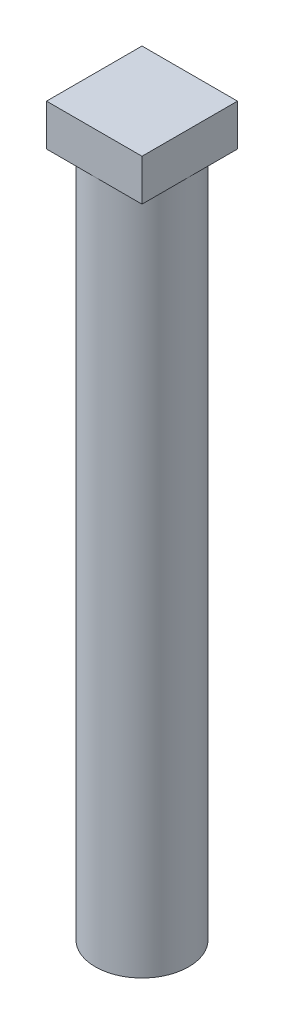
ISO-10303-21;
HEADER;
FILE_DESCRIPTION(('STEP AP214'),'2;1');
FILE_NAME('part.step','',(''),(''),'','','');
FILE_SCHEMA(('AUTOMOTIVE_DESIGN { 1 0 10303 214 1 1 1 1 }'));
ENDSEC;
DATA;
#1=APPLICATION_CONTEXT('core data for automotive mechanical design processes');
#2=APPLICATION_PROTOCOL_DEFINITION('international standard','automotive_design',2000,#1);
#3=PRODUCT_CONTEXT('',#1,'mechanical');
#4=PRODUCT('Part','Part','',(#3));
#5=PRODUCT_RELATED_PRODUCT_CATEGORY('part','',(#4));
#6=PRODUCT_DEFINITION_FORMATION('','',#4);
#7=PRODUCT_DEFINITION_CONTEXT('part definition',#1,'design');
#8=PRODUCT_DEFINITION('design','',#6,#7);
#9=PRODUCT_DEFINITION_SHAPE('','',#8);
#10=(LENGTH_UNIT() NAMED_UNIT(*) SI_UNIT(.MILLI.,.METRE.));
#11=(NAMED_UNIT(*) PLANE_ANGLE_UNIT() SI_UNIT($,.RADIAN.));
#12=(NAMED_UNIT(*) SI_UNIT($,.STERADIAN.) SOLID_ANGLE_UNIT());
#13=UNCERTAINTY_MEASURE_WITH_UNIT(LENGTH_MEASURE(1.E-05),#10,'distance_accuracy_value','');
#14=(GEOMETRIC_REPRESENTATION_CONTEXT(3) GLOBAL_UNCERTAINTY_ASSIGNED_CONTEXT((#13)) GLOBAL_UNIT_ASSIGNED_CONTEXT((#10,
#11,#12)) REPRESENTATION_CONTEXT('',''));
#15=CARTESIAN_POINT('',(0.,0.,0.));
#16=DIRECTION('',(0.,0.,1.));
#17=DIRECTION('',(1.,0.,0.));
#18=AXIS2_PLACEMENT_3D('',#15,#16,#17);
#19=CARTESIAN_POINT('',(0.,35.,0.));
#20=DIRECTION('',(0.,-1.,0.));
#21=DIRECTION('',(0.,0.,-1.));
#22=AXIS2_PLACEMENT_3D('',#19,#20,#21);
#23=CYLINDRICAL_SURFACE('',#22,2.25);
#24=CARTESIAN_POINT('',(0.,33.,0.));
#25=DIRECTION('',(0.,-1.,0.));
#26=DIRECTION('',(0.,0.,-1.));
#27=AXIS2_PLACEMENT_3D('',#24,#25,#26);
#28=CIRCLE('',#27,2.25);
#29=CARTESIAN_POINT('',(0.,33.,-2.25));
#30=VERTEX_POINT('',#29);
#31=EDGE_CURVE('E40',#30,#30,#28,.T.);
#32=ORIENTED_EDGE('',*,*,#31,.T.);
#33=EDGE_LOOP('',(#32));
#34=FACE_BOUND('',#33,.T.);
#35=CARTESIAN_POINT('',(0.,0.,0.));
#36=DIRECTION('',(0.,1.,0.));
#37=DIRECTION('',(0.,0.,1.));
#38=AXIS2_PLACEMENT_3D('',#35,#36,#37);
#39=CIRCLE('',#38,2.25);
#40=CARTESIAN_POINT('',(0.,0.,2.25));
#41=VERTEX_POINT('',#40);
#42=EDGE_CURVE('E11',#41,#41,#39,.T.);
#43=ORIENTED_EDGE('',*,*,#42,.T.);
#44=EDGE_LOOP('',(#43));
#45=FACE_BOUND('',#44,.T.);
#46=ADVANCED_FACE('F37',(#34,#45),#23,.T.);
#47=CARTESIAN_POINT('',(0.,0.,0.));
#48=DIRECTION('',(0.,1.,0.));
#49=DIRECTION('',(0.,0.,1.));
#50=AXIS2_PLACEMENT_3D('',#47,#48,#49);
#51=PLANE('',#50);
#52=ORIENTED_EDGE('',*,*,#42,.F.);
#53=EDGE_LOOP('',(#52));
#54=FACE_BOUND('',#53,.T.);
#55=ADVANCED_FACE('F125',(#54),#51,.F.);
#56=CARTESIAN_POINT('',(2.3,33.,2.3));
#57=DIRECTION('',(1.,0.,0.));
#58=DIRECTION('',(0.,0.,-1.));
#59=AXIS2_PLACEMENT_3D('',#56,#57,#58);
#60=PLANE('',#59);
#61=DIRECTION('',(0.,0.,-1.));
#62=VECTOR('',#61,1.);
#63=CARTESIAN_POINT('',(2.3,35.,2.3));
#64=LINE('',#63,#62);
#65=CARTESIAN_POINT('',(2.3,35.,2.3));
#66=VERTEX_POINT('',#65);
#67=CARTESIAN_POINT('',(2.3,35.,-2.3));
#68=VERTEX_POINT('',#67);
#69=EDGE_CURVE('E104',#66,#68,#64,.T.);
#70=ORIENTED_EDGE('',*,*,#69,.F.);
#71=DIRECTION('',(0.,1.,0.));
#72=VECTOR('',#71,1.);
#73=CARTESIAN_POINT('',(2.3,33.,2.3));
#74=LINE('',#73,#72);
#75=CARTESIAN_POINT('',(2.3,33.,2.3));
#76=VERTEX_POINT('',#75);
#77=EDGE_CURVE('E53',#76,#66,#74,.T.);
#78=ORIENTED_EDGE('',*,*,#77,.F.);
#79=DIRECTION('',(0.,0.,-1.));
#80=VECTOR('',#79,1.);
#81=CARTESIAN_POINT('',(2.3,33.,2.3));
#82=LINE('',#81,#80);
#83=CARTESIAN_POINT('',(2.3,33.,-2.3));
#84=VERTEX_POINT('',#83);
#85=EDGE_CURVE('E98',#76,#84,#82,.T.);
#86=ORIENTED_EDGE('',*,*,#85,.T.);
#87=DIRECTION('',(0.,1.,0.));
#88=VECTOR('',#87,1.);
#89=CARTESIAN_POINT('',(2.3,33.,-2.3));
#90=LINE('',#89,#88);
#91=EDGE_CURVE('E81',#84,#68,#90,.T.);
#92=ORIENTED_EDGE('',*,*,#91,.T.);
#93=EDGE_LOOP('',(#70,#78,#86,#92));
#94=FACE_BOUND('',#93,.T.);
#95=ADVANCED_FACE('F114',(#94),#60,.T.);
#96=CARTESIAN_POINT('',(-2.3,33.,2.3));
#97=DIRECTION('',(0.,0.,1.));
#98=DIRECTION('',(1.,0.,0.));
#99=AXIS2_PLACEMENT_3D('',#96,#97,#98);
#100=PLANE('',#99);
#101=DIRECTION('',(1.,0.,0.));
#102=VECTOR('',#101,1.);
#103=CARTESIAN_POINT('',(-2.3,35.,2.3));
#104=LINE('',#103,#102);
#105=CARTESIAN_POINT('',(-2.3,35.,2.3));
#106=VERTEX_POINT('',#105);
#107=EDGE_CURVE('E100',#106,#66,#104,.T.);
#108=ORIENTED_EDGE('',*,*,#107,.F.);
#109=DIRECTION('',(0.,1.,0.));
#110=VECTOR('',#109,1.);
#111=CARTESIAN_POINT('',(-2.3,33.,2.3));
#112=LINE('',#111,#110);
#113=CARTESIAN_POINT('',(-2.3,33.,2.3));
#114=VERTEX_POINT('',#113);
#115=EDGE_CURVE('E70',#114,#106,#112,.T.);
#116=ORIENTED_EDGE('',*,*,#115,.F.);
#117=DIRECTION('',(1.,0.,0.));
#118=VECTOR('',#117,1.);
#119=CARTESIAN_POINT('',(-2.3,33.,2.3));
#120=LINE('',#119,#118);
#121=EDGE_CURVE('E95',#114,#76,#120,.T.);
#122=ORIENTED_EDGE('',*,*,#121,.T.);
#123=ORIENTED_EDGE('',*,*,#77,.T.);
#124=EDGE_LOOP('',(#108,#116,#122,#123));
#125=FACE_BOUND('',#124,.T.);
#126=ADVANCED_FACE('F117',(#125),#100,.T.);
#127=CARTESIAN_POINT('',(-2.3,33.,2.3));
#128=DIRECTION('',(-1.,0.,0.));
#129=DIRECTION('',(0.,0.,1.));
#130=AXIS2_PLACEMENT_3D('',#127,#128,#129);
#131=PLANE('',#130);
#132=DIRECTION('',(0.,0.,1.));
#133=VECTOR('',#132,1.);
#134=CARTESIAN_POINT('',(-2.3,35.,2.3));
#135=LINE('',#134,#133);
#136=CARTESIAN_POINT('',(-2.3,35.,-2.3));
#137=VERTEX_POINT('',#136);
#138=EDGE_CURVE('E89',#137,#106,#135,.T.);
#139=ORIENTED_EDGE('',*,*,#138,.F.);
#140=DIRECTION('',(0.,1.,0.));
#141=VECTOR('',#140,1.);
#142=CARTESIAN_POINT('',(-2.3,33.,-2.3));
#143=LINE('',#142,#141);
#144=CARTESIAN_POINT('',(-2.3,33.,-2.3));
#145=VERTEX_POINT('',#144);
#146=EDGE_CURVE('E84',#145,#137,#143,.T.);
#147=ORIENTED_EDGE('',*,*,#146,.F.);
#148=DIRECTION('',(0.,0.,1.));
#149=VECTOR('',#148,1.);
#150=CARTESIAN_POINT('',(-2.3,33.,2.3));
#151=LINE('',#150,#149);
#152=EDGE_CURVE('E87',#145,#114,#151,.T.);
#153=ORIENTED_EDGE('',*,*,#152,.T.);
#154=ORIENTED_EDGE('',*,*,#115,.T.);
#155=EDGE_LOOP('',(#139,#147,#153,#154));
#156=FACE_BOUND('',#155,.T.);
#157=ADVANCED_FACE('F86',(#156),#131,.T.);
#158=CARTESIAN_POINT('',(-2.3,33.,-2.3));
#159=DIRECTION('',(0.,0.,-1.));
#160=DIRECTION('',(-1.,0.,0.));
#161=AXIS2_PLACEMENT_3D('',#158,#159,#160);
#162=PLANE('',#161);
#163=DIRECTION('',(-1.,0.,0.));
#164=VECTOR('',#163,1.);
#165=CARTESIAN_POINT('',(-2.3,35.,-2.3));
#166=LINE('',#165,#164);
#167=EDGE_CURVE('E107',#68,#137,#166,.T.);
#168=ORIENTED_EDGE('',*,*,#167,.F.);
#169=ORIENTED_EDGE('',*,*,#91,.F.);
#170=DIRECTION('',(-1.,0.,0.));
#171=VECTOR('',#170,1.);
#172=CARTESIAN_POINT('',(-2.3,33.,-2.3));
#173=LINE('',#172,#171);
#174=EDGE_CURVE('E94',#84,#145,#173,.T.);
#175=ORIENTED_EDGE('',*,*,#174,.T.);
#176=ORIENTED_EDGE('',*,*,#146,.T.);
#177=EDGE_LOOP('',(#168,#169,#175,#176));
#178=FACE_BOUND('',#177,.T.);
#179=ADVANCED_FACE('F97',(#178),#162,.T.);
#180=CARTESIAN_POINT('',(0.,33.,0.));
#181=DIRECTION('',(0.,-1.,0.));
#182=DIRECTION('',(0.,0.,-1.));
#183=AXIS2_PLACEMENT_3D('',#180,#181,#182);
#184=PLANE('',#183);
#185=ORIENTED_EDGE('',*,*,#31,.F.);
#186=EDGE_LOOP('',(#185));
#187=FACE_BOUND('',#186,.T.);
#188=ORIENTED_EDGE('',*,*,#85,.F.);
#189=ORIENTED_EDGE('',*,*,#121,.F.);
#190=ORIENTED_EDGE('',*,*,#152,.F.);
#191=ORIENTED_EDGE('',*,*,#174,.F.);
#192=EDGE_LOOP('',(#188,#189,#190,#191));
#193=FACE_BOUND('',#192,.T.);
#194=ADVANCED_FACE('F93',(#187,#193),#184,.T.);
#195=CARTESIAN_POINT('',(0.,35.,0.));
#196=DIRECTION('',(0.,1.,0.));
#197=DIRECTION('',(0.,0.,1.));
#198=AXIS2_PLACEMENT_3D('',#195,#196,#197);
#199=PLANE('',#198);
#200=ORIENTED_EDGE('',*,*,#69,.T.);
#201=ORIENTED_EDGE('',*,*,#167,.T.);
#202=ORIENTED_EDGE('',*,*,#138,.T.);
#203=ORIENTED_EDGE('',*,*,#107,.T.);
#204=EDGE_LOOP('',(#200,#201,#202,#203));
#205=FACE_BOUND('',#204,.T.);
#206=ADVANCED_FACE('F116',(#205),#199,.T.);
#207=CLOSED_SHELL('',(#46,#55,#95,#126,#157,#179,#194,#206));
#208=MANIFOLD_SOLID_BREP('B2',#207);
#209=ADVANCED_BREP_SHAPE_REPRESENTATION('',(#18,#208),#14);
#210=SHAPE_DEFINITION_REPRESENTATION(#9,#209);
ENDSEC;
END-ISO-10303-21;
